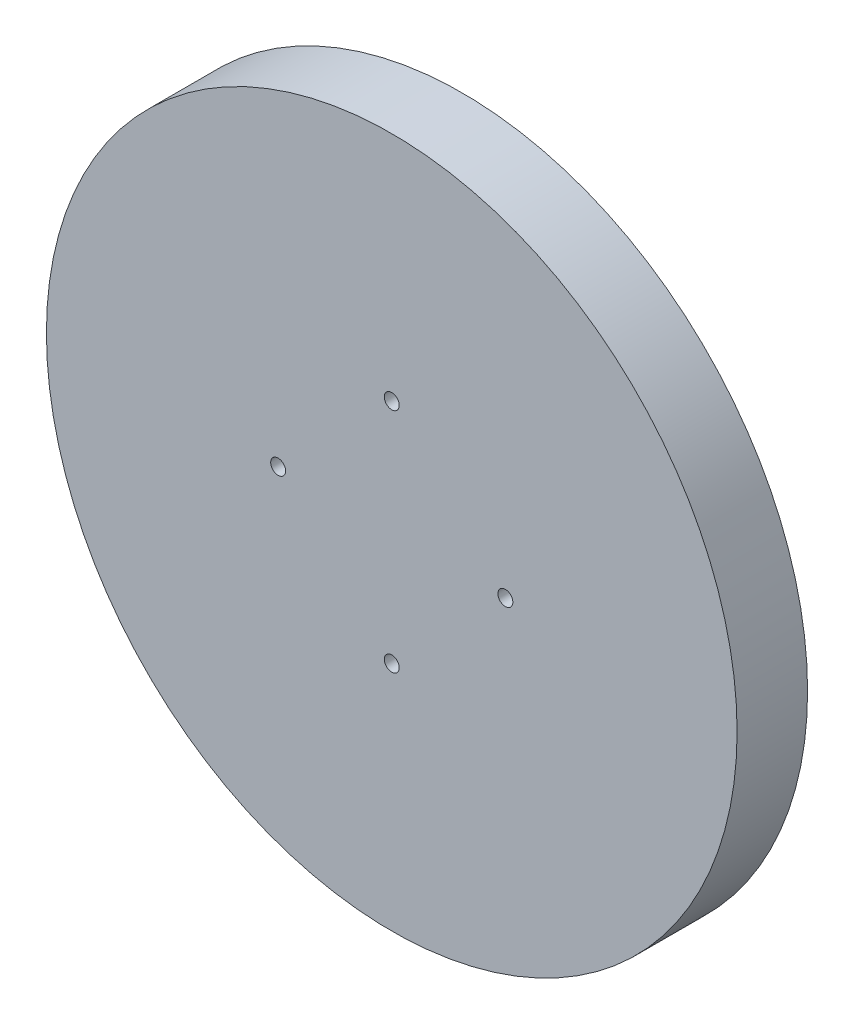
ISO-10303-21;
HEADER;
FILE_DESCRIPTION(('STEP AP214'),'2;1');
FILE_NAME('part.step','',(''),(''),'','','');
FILE_SCHEMA(('AUTOMOTIVE_DESIGN { 1 0 10303 214 1 1 1 1 }'));
ENDSEC;
DATA;
#1=APPLICATION_CONTEXT('core data for automotive mechanical design processes');
#2=APPLICATION_PROTOCOL_DEFINITION('international standard','automotive_design',2000,#1);
#3=PRODUCT_CONTEXT('',#1,'mechanical');
#4=PRODUCT('Part','Part','',(#3));
#5=PRODUCT_RELATED_PRODUCT_CATEGORY('part','',(#4));
#6=PRODUCT_DEFINITION_FORMATION('','',#4);
#7=PRODUCT_DEFINITION_CONTEXT('part definition',#1,'design');
#8=PRODUCT_DEFINITION('design','',#6,#7);
#9=PRODUCT_DEFINITION_SHAPE('','',#8);
#10=(LENGTH_UNIT() NAMED_UNIT(*) SI_UNIT(.MILLI.,.METRE.));
#11=(NAMED_UNIT(*) PLANE_ANGLE_UNIT() SI_UNIT($,.RADIAN.));
#12=(NAMED_UNIT(*) SI_UNIT($,.STERADIAN.) SOLID_ANGLE_UNIT());
#13=UNCERTAINTY_MEASURE_WITH_UNIT(LENGTH_MEASURE(1.E-05),#10,'distance_accuracy_value','');
#14=(GEOMETRIC_REPRESENTATION_CONTEXT(3) GLOBAL_UNCERTAINTY_ASSIGNED_CONTEXT((#13)) GLOBAL_UNIT_ASSIGNED_CONTEXT((#10,
#11,#12)) REPRESENTATION_CONTEXT('',''));
#15=CARTESIAN_POINT('',(0.,0.,0.));
#16=DIRECTION('',(0.,0.,1.));
#17=DIRECTION('',(1.,0.,0.));
#18=AXIS2_PLACEMENT_3D('',#15,#16,#17);
#19=CARTESIAN_POINT('',(0.,0.,5.));
#20=DIRECTION('',(0.,0.,-1.));
#21=DIRECTION('',(-1.,0.,0.));
#22=AXIS2_PLACEMENT_3D('',#19,#20,#21);
#23=CYLINDRICAL_SURFACE('',#22,24.5);
#24=CARTESIAN_POINT('',(0.,0.,5.));
#25=DIRECTION('',(0.,0.,1.));
#26=DIRECTION('',(1.,0.,0.));
#27=AXIS2_PLACEMENT_3D('',#24,#25,#26);
#28=CIRCLE('',#27,24.5);
#29=CARTESIAN_POINT('',(24.5,0.,5.));
#30=VERTEX_POINT('',#29);
#31=EDGE_CURVE('E10',#30,#30,#28,.T.);
#32=ORIENTED_EDGE('',*,*,#31,.F.);
#33=EDGE_LOOP('',(#32));
#34=FACE_BOUND('',#33,.T.);
#35=CARTESIAN_POINT('',(0.,0.,0.));
#36=DIRECTION('',(0.,0.,1.));
#37=DIRECTION('',(1.,0.,0.));
#38=AXIS2_PLACEMENT_3D('',#35,#36,#37);
#39=CIRCLE('',#38,24.5);
#40=CARTESIAN_POINT('',(24.5,0.,0.));
#41=VERTEX_POINT('',#40);
#42=EDGE_CURVE('E40',#41,#41,#39,.T.);
#43=ORIENTED_EDGE('',*,*,#42,.T.);
#44=EDGE_LOOP('',(#43));
#45=FACE_BOUND('',#44,.T.);
#46=ADVANCED_FACE('F37',(#34,#45),#23,.T.);
#47=CARTESIAN_POINT('',(0.,0.,5.));
#48=DIRECTION('',(0.,0.,1.));
#49=DIRECTION('',(1.,0.,0.));
#50=AXIS2_PLACEMENT_3D('',#47,#48,#49);
#51=PLANE('',#50);
#52=CARTESIAN_POINT('',(8.06,0.,5.));
#53=DIRECTION('',(0.,0.,1.));
#54=DIRECTION('',(0.,-1.,0.));
#55=AXIS2_PLACEMENT_3D('',#52,#53,#54);
#56=CIRCLE('',#55,0.53);
#57=CARTESIAN_POINT('',(8.06,-0.530000000000028,5.));
#58=VERTEX_POINT('',#57);
#59=EDGE_CURVE('E54',#58,#58,#56,.T.);
#60=ORIENTED_EDGE('',*,*,#59,.F.);
#61=EDGE_LOOP('',(#60));
#62=FACE_BOUND('',#61,.T.);
#63=CARTESIAN_POINT('',(0.,-8.06,5.));
#64=DIRECTION('',(0.,0.,1.));
#65=DIRECTION('',(-1.,0.,0.));
#66=AXIS2_PLACEMENT_3D('',#63,#64,#65);
#67=CIRCLE('',#66,0.53);
#68=CARTESIAN_POINT('',(-0.53,-8.06,5.));
#69=VERTEX_POINT('',#68);
#70=EDGE_CURVE('E62',#69,#69,#67,.T.);
#71=ORIENTED_EDGE('',*,*,#70,.F.);
#72=EDGE_LOOP('',(#71));
#73=FACE_BOUND('',#72,.T.);
#74=CARTESIAN_POINT('',(-8.06,0.,5.));
#75=DIRECTION('',(0.,0.,1.));
#76=DIRECTION('',(0.,1.,0.));
#77=AXIS2_PLACEMENT_3D('',#74,#75,#76);
#78=CIRCLE('',#77,0.53);
#79=CARTESIAN_POINT('',(-8.06,0.530000000000085,5.));
#80=VERTEX_POINT('',#79);
#81=EDGE_CURVE('E55',#80,#80,#78,.T.);
#82=ORIENTED_EDGE('',*,*,#81,.F.);
#83=EDGE_LOOP('',(#82));
#84=FACE_BOUND('',#83,.T.);
#85=CARTESIAN_POINT('',(0.,8.06,5.));
#86=DIRECTION('',(0.,0.,1.));
#87=DIRECTION('',(1.,0.,0.));
#88=AXIS2_PLACEMENT_3D('',#85,#86,#87);
#89=CIRCLE('',#88,0.53);
#90=CARTESIAN_POINT('',(0.53,8.06,5.));
#91=VERTEX_POINT('',#90);
#92=EDGE_CURVE('E51',#91,#91,#89,.T.);
#93=ORIENTED_EDGE('',*,*,#92,.F.);
#94=EDGE_LOOP('',(#93));
#95=FACE_BOUND('',#94,.T.);
#96=ORIENTED_EDGE('',*,*,#31,.T.);
#97=EDGE_LOOP('',(#96));
#98=FACE_BOUND('',#97,.T.);
#99=ADVANCED_FACE('F80',(#62,#73,#84,#95,#98),#51,.T.);
#100=CARTESIAN_POINT('',(0.,0.,0.));
#101=DIRECTION('',(0.,0.,1.));
#102=DIRECTION('',(1.,0.,0.));
#103=AXIS2_PLACEMENT_3D('',#100,#101,#102);
#104=PLANE('',#103);
#105=CARTESIAN_POINT('',(8.06,0.,0.));
#106=DIRECTION('',(0.,0.,1.));
#107=DIRECTION('',(0.,-1.,0.));
#108=AXIS2_PLACEMENT_3D('',#105,#106,#107);
#109=CIRCLE('',#108,0.53);
#110=CARTESIAN_POINT('',(8.06,-0.530000000000028,0.));
#111=VERTEX_POINT('',#110);
#112=EDGE_CURVE('E65',#111,#111,#109,.F.);
#113=ORIENTED_EDGE('',*,*,#112,.F.);
#114=EDGE_LOOP('',(#113));
#115=FACE_BOUND('',#114,.T.);
#116=CARTESIAN_POINT('',(0.,-8.06,0.));
#117=DIRECTION('',(0.,0.,1.));
#118=DIRECTION('',(-1.,0.,0.));
#119=AXIS2_PLACEMENT_3D('',#116,#117,#118);
#120=CIRCLE('',#119,0.53);
#121=CARTESIAN_POINT('',(-0.53,-8.06,0.));
#122=VERTEX_POINT('',#121);
#123=EDGE_CURVE('E58',#122,#122,#120,.F.);
#124=ORIENTED_EDGE('',*,*,#123,.F.);
#125=EDGE_LOOP('',(#124));
#126=FACE_BOUND('',#125,.T.);
#127=CARTESIAN_POINT('',(-8.06,0.,0.));
#128=DIRECTION('',(0.,0.,1.));
#129=DIRECTION('',(0.,1.,0.));
#130=AXIS2_PLACEMENT_3D('',#127,#128,#129);
#131=CIRCLE('',#130,0.53);
#132=CARTESIAN_POINT('',(-8.06,0.530000000000085,0.));
#133=VERTEX_POINT('',#132);
#134=EDGE_CURVE('E59',#133,#133,#131,.F.);
#135=ORIENTED_EDGE('',*,*,#134,.F.);
#136=EDGE_LOOP('',(#135));
#137=FACE_BOUND('',#136,.T.);
#138=CARTESIAN_POINT('',(0.,8.06,0.));
#139=DIRECTION('',(0.,0.,1.));
#140=DIRECTION('',(1.,0.,0.));
#141=AXIS2_PLACEMENT_3D('',#138,#139,#140);
#142=CIRCLE('',#141,0.53);
#143=CARTESIAN_POINT('',(0.53,8.06,0.));
#144=VERTEX_POINT('',#143);
#145=EDGE_CURVE('E47',#144,#144,#142,.F.);
#146=ORIENTED_EDGE('',*,*,#145,.F.);
#147=EDGE_LOOP('',(#146));
#148=FACE_BOUND('',#147,.T.);
#149=ORIENTED_EDGE('',*,*,#42,.F.);
#150=EDGE_LOOP('',(#149));
#151=FACE_BOUND('',#150,.T.);
#152=ADVANCED_FACE('F76',(#115,#126,#137,#148,#151),#104,.F.);
#153=CARTESIAN_POINT('',(0.,8.06,-1.49906637611548));
#154=DIRECTION('',(0.,0.,1.));
#155=DIRECTION('',(1.,0.,0.));
#156=AXIS2_PLACEMENT_3D('',#153,#154,#155);
#157=CYLINDRICAL_SURFACE('',#156,0.53);
#158=ORIENTED_EDGE('',*,*,#145,.T.);
#159=EDGE_LOOP('',(#158));
#160=FACE_BOUND('',#159,.T.);
#161=ORIENTED_EDGE('',*,*,#92,.T.);
#162=EDGE_LOOP('',(#161));
#163=FACE_BOUND('',#162,.T.);
#164=ADVANCED_FACE('F79',(#160,#163),#157,.F.);
#165=CARTESIAN_POINT('',(-8.06,0.,-1.49906637611548));
#166=DIRECTION('',(0.,0.,1.));
#167=DIRECTION('',(0.,1.,0.));
#168=AXIS2_PLACEMENT_3D('',#165,#166,#167);
#169=CYLINDRICAL_SURFACE('',#168,0.53);
#170=ORIENTED_EDGE('',*,*,#134,.T.);
#171=EDGE_LOOP('',(#170));
#172=FACE_BOUND('',#171,.T.);
#173=ORIENTED_EDGE('',*,*,#81,.T.);
#174=EDGE_LOOP('',(#173));
#175=FACE_BOUND('',#174,.T.);
#176=ADVANCED_FACE('F103',(#172,#175),#169,.F.);
#177=CARTESIAN_POINT('',(0.,-8.06,-1.49906637611548));
#178=DIRECTION('',(0.,0.,1.));
#179=DIRECTION('',(-1.,0.,0.));
#180=AXIS2_PLACEMENT_3D('',#177,#178,#179);
#181=CYLINDRICAL_SURFACE('',#180,0.53);
#182=ORIENTED_EDGE('',*,*,#123,.T.);
#183=EDGE_LOOP('',(#182));
#184=FACE_BOUND('',#183,.T.);
#185=ORIENTED_EDGE('',*,*,#70,.T.);
#186=EDGE_LOOP('',(#185));
#187=FACE_BOUND('',#186,.T.);
#188=ADVANCED_FACE('F107',(#184,#187),#181,.F.);
#189=CARTESIAN_POINT('',(8.06,0.,-1.49906637611548));
#190=DIRECTION('',(0.,0.,1.));
#191=DIRECTION('',(0.,-1.,0.));
#192=AXIS2_PLACEMENT_3D('',#189,#190,#191);
#193=CYLINDRICAL_SURFACE('',#192,0.53);
#194=ORIENTED_EDGE('',*,*,#112,.T.);
#195=EDGE_LOOP('',(#194));
#196=FACE_BOUND('',#195,.T.);
#197=ORIENTED_EDGE('',*,*,#59,.T.);
#198=EDGE_LOOP('',(#197));
#199=FACE_BOUND('',#198,.T.);
#200=ADVANCED_FACE('F73',(#196,#199),#193,.F.);
#201=CLOSED_SHELL('',(#46,#99,#152,#164,#176,#188,#200));
#202=MANIFOLD_SOLID_BREP('B2',#201);
#203=ADVANCED_BREP_SHAPE_REPRESENTATION('',(#18,#202),#14);
#204=SHAPE_DEFINITION_REPRESENTATION(#9,#203);
ENDSEC;
END-ISO-10303-21;
